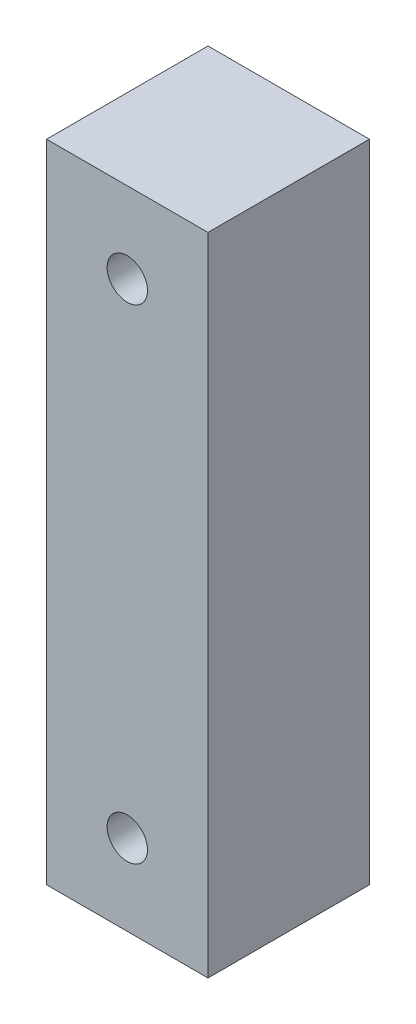
ISO-10303-21;
HEADER;
FILE_DESCRIPTION(('STEP AP214'),'2;1');
FILE_NAME('part.step','',(''),(''),'','','');
FILE_SCHEMA(('AUTOMOTIVE_DESIGN { 1 0 10303 214 1 1 1 1 }'));
ENDSEC;
DATA;
#1=APPLICATION_CONTEXT('core data for automotive mechanical design processes');
#2=APPLICATION_PROTOCOL_DEFINITION('international standard','automotive_design',2000,#1);
#3=PRODUCT_CONTEXT('',#1,'mechanical');
#4=PRODUCT('Part','Part','',(#3));
#5=PRODUCT_RELATED_PRODUCT_CATEGORY('part','',(#4));
#6=PRODUCT_DEFINITION_FORMATION('','',#4);
#7=PRODUCT_DEFINITION_CONTEXT('part definition',#1,'design');
#8=PRODUCT_DEFINITION('design','',#6,#7);
#9=PRODUCT_DEFINITION_SHAPE('','',#8);
#10=(LENGTH_UNIT() NAMED_UNIT(*) SI_UNIT(.MILLI.,.METRE.));
#11=(NAMED_UNIT(*) PLANE_ANGLE_UNIT() SI_UNIT($,.RADIAN.));
#12=(NAMED_UNIT(*) SI_UNIT($,.STERADIAN.) SOLID_ANGLE_UNIT());
#13=UNCERTAINTY_MEASURE_WITH_UNIT(LENGTH_MEASURE(1.E-05),#10,'distance_accuracy_value','');
#14=(GEOMETRIC_REPRESENTATION_CONTEXT(3) GLOBAL_UNCERTAINTY_ASSIGNED_CONTEXT((#13)) GLOBAL_UNIT_ASSIGNED_CONTEXT((#10,
#11,#12)) REPRESENTATION_CONTEXT('',''));
#15=CARTESIAN_POINT('',(0.,0.,0.));
#16=DIRECTION('',(0.,0.,1.));
#17=DIRECTION('',(1.,0.,0.));
#18=AXIS2_PLACEMENT_3D('',#15,#16,#17);
#19=CARTESIAN_POINT('',(0.,0.,38.1));
#20=DIRECTION('',(1.,0.,0.));
#21=DIRECTION('',(0.,1.,0.));
#22=AXIS2_PLACEMENT_3D('',#19,#20,#21);
#23=PLANE('',#22);
#24=DIRECTION('',(0.,-1.,0.));
#25=VECTOR('',#24,1.);
#26=CARTESIAN_POINT('',(0.,0.,0.));
#27=LINE('',#26,#25);
#28=CARTESIAN_POINT('',(0.,152.4,0.));
#29=VERTEX_POINT('',#28);
#30=CARTESIAN_POINT('',(0.,0.,0.));
#31=VERTEX_POINT('',#30);
#32=EDGE_CURVE('E101',#29,#31,#27,.T.);
#33=ORIENTED_EDGE('',*,*,#32,.T.);
#34=DIRECTION('',(0.,0.,-1.));
#35=VECTOR('',#34,1.);
#36=CARTESIAN_POINT('',(0.,0.,38.1));
#37=LINE('',#36,#35);
#38=CARTESIAN_POINT('',(0.,0.,38.1));
#39=VERTEX_POINT('',#38);
#40=EDGE_CURVE('E11',#39,#31,#37,.T.);
#41=ORIENTED_EDGE('',*,*,#40,.F.);
#42=DIRECTION('',(0.,-1.,0.));
#43=VECTOR('',#42,1.);
#44=CARTESIAN_POINT('',(0.,0.,38.1));
#45=LINE('',#44,#43);
#46=CARTESIAN_POINT('',(0.,152.4,38.1));
#47=VERTEX_POINT('',#46);
#48=EDGE_CURVE('E89',#47,#39,#45,.T.);
#49=ORIENTED_EDGE('',*,*,#48,.F.);
#50=DIRECTION('',(0.,0.,-1.));
#51=VECTOR('',#50,1.);
#52=CARTESIAN_POINT('',(0.,152.4,38.1));
#53=LINE('',#52,#51);
#54=EDGE_CURVE('E97',#47,#29,#53,.T.);
#55=ORIENTED_EDGE('',*,*,#54,.T.);
#56=EDGE_LOOP('',(#33,#41,#49,#55));
#57=FACE_BOUND('',#56,.T.);
#58=ADVANCED_FACE('F38',(#57),#23,.F.);
#59=CARTESIAN_POINT('',(0.,0.,38.1));
#60=DIRECTION('',(0.,1.,0.));
#61=DIRECTION('',(0.,0.,1.));
#62=AXIS2_PLACEMENT_3D('',#59,#60,#61);
#63=PLANE('',#62);
#64=DIRECTION('',(1.,0.,0.));
#65=VECTOR('',#64,1.);
#66=CARTESIAN_POINT('',(0.,0.,0.));
#67=LINE('',#66,#65);
#68=CARTESIAN_POINT('',(38.1,0.,0.));
#69=VERTEX_POINT('',#68);
#70=EDGE_CURVE('E93',#31,#69,#67,.T.);
#71=ORIENTED_EDGE('',*,*,#70,.T.);
#72=DIRECTION('',(0.,0.,-1.));
#73=VECTOR('',#72,1.);
#74=CARTESIAN_POINT('',(38.1,0.,38.1));
#75=LINE('',#74,#73);
#76=CARTESIAN_POINT('',(38.1,0.,38.1));
#77=VERTEX_POINT('',#76);
#78=EDGE_CURVE('E46',#77,#69,#75,.T.);
#79=ORIENTED_EDGE('',*,*,#78,.F.);
#80=DIRECTION('',(1.,0.,0.));
#81=VECTOR('',#80,1.);
#82=CARTESIAN_POINT('',(0.,0.,38.1));
#83=LINE('',#82,#81);
#84=EDGE_CURVE('E84',#39,#77,#83,.T.);
#85=ORIENTED_EDGE('',*,*,#84,.F.);
#86=ORIENTED_EDGE('',*,*,#40,.T.);
#87=EDGE_LOOP('',(#71,#79,#85,#86));
#88=FACE_BOUND('',#87,.T.);
#89=ADVANCED_FACE('F92',(#88),#63,.F.);
#90=CARTESIAN_POINT('',(38.1,0.,38.1));
#91=DIRECTION('',(-1.,0.,0.));
#92=DIRECTION('',(0.,-1.,0.));
#93=AXIS2_PLACEMENT_3D('',#90,#91,#92);
#94=PLANE('',#93);
#95=DIRECTION('',(0.,1.,0.));
#96=VECTOR('',#95,1.);
#97=CARTESIAN_POINT('',(38.1,0.,0.));
#98=LINE('',#97,#96);
#99=CARTESIAN_POINT('',(38.1,152.4,0.));
#100=VERTEX_POINT('',#99);
#101=EDGE_CURVE('E71',#69,#100,#98,.T.);
#102=ORIENTED_EDGE('',*,*,#101,.T.);
#103=DIRECTION('',(0.,0.,-1.));
#104=VECTOR('',#103,1.);
#105=CARTESIAN_POINT('',(38.1,152.4,38.1));
#106=LINE('',#105,#104);
#107=CARTESIAN_POINT('',(38.1,152.4,38.1));
#108=VERTEX_POINT('',#107);
#109=EDGE_CURVE('E94',#108,#100,#106,.T.);
#110=ORIENTED_EDGE('',*,*,#109,.F.);
#111=DIRECTION('',(0.,1.,0.));
#112=VECTOR('',#111,1.);
#113=CARTESIAN_POINT('',(38.1,0.,38.1));
#114=LINE('',#113,#112);
#115=EDGE_CURVE('E87',#77,#108,#114,.T.);
#116=ORIENTED_EDGE('',*,*,#115,.F.);
#117=ORIENTED_EDGE('',*,*,#78,.T.);
#118=EDGE_LOOP('',(#102,#110,#116,#117));
#119=FACE_BOUND('',#118,.T.);
#120=ADVANCED_FACE('F95',(#119),#94,.F.);
#121=CARTESIAN_POINT('',(0.,152.4,38.1));
#122=DIRECTION('',(0.,-1.,0.));
#123=DIRECTION('',(0.,0.,-1.));
#124=AXIS2_PLACEMENT_3D('',#121,#122,#123);
#125=PLANE('',#124);
#126=DIRECTION('',(-1.,0.,0.));
#127=VECTOR('',#126,1.);
#128=CARTESIAN_POINT('',(0.,152.4,0.));
#129=LINE('',#128,#127);
#130=EDGE_CURVE('E77',#100,#29,#129,.T.);
#131=ORIENTED_EDGE('',*,*,#130,.T.);
#132=ORIENTED_EDGE('',*,*,#54,.F.);
#133=DIRECTION('',(-1.,0.,0.));
#134=VECTOR('',#133,1.);
#135=CARTESIAN_POINT('',(0.,152.4,38.1));
#136=LINE('',#135,#134);
#137=EDGE_CURVE('E54',#108,#47,#136,.T.);
#138=ORIENTED_EDGE('',*,*,#137,.F.);
#139=ORIENTED_EDGE('',*,*,#109,.T.);
#140=EDGE_LOOP('',(#131,#132,#138,#139));
#141=FACE_BOUND('',#140,.T.);
#142=ADVANCED_FACE('F109',(#141),#125,.F.);
#143=CARTESIAN_POINT('',(0.,0.,38.1));
#144=DIRECTION('',(0.,0.,-1.));
#145=DIRECTION('',(-1.,0.,0.));
#146=AXIS2_PLACEMENT_3D('',#143,#144,#145);
#147=PLANE('',#146);
#148=CARTESIAN_POINT('',(19.05,19.05,38.1));
#149=DIRECTION('',(0.,0.,1.));
#150=DIRECTION('',(1.,0.,0.));
#151=AXIS2_PLACEMENT_3D('',#148,#149,#150);
#152=CIRCLE('',#151,4.7625);
#153=CARTESIAN_POINT('',(23.8125,19.05,38.1));
#154=VERTEX_POINT('',#153);
#155=EDGE_CURVE('E121',#154,#154,#152,.T.);
#156=ORIENTED_EDGE('',*,*,#155,.F.);
#157=EDGE_LOOP('',(#156));
#158=FACE_BOUND('',#157,.T.);
#159=CARTESIAN_POINT('',(19.05,133.35,38.1));
#160=DIRECTION('',(0.,0.,1.));
#161=DIRECTION('',(1.,0.,0.));
#162=AXIS2_PLACEMENT_3D('',#159,#160,#161);
#163=CIRCLE('',#162,4.7625);
#164=CARTESIAN_POINT('',(23.8125,133.35,38.1));
#165=VERTEX_POINT('',#164);
#166=EDGE_CURVE('E115',#165,#165,#163,.T.);
#167=ORIENTED_EDGE('',*,*,#166,.F.);
#168=EDGE_LOOP('',(#167));
#169=FACE_BOUND('',#168,.T.);
#170=ORIENTED_EDGE('',*,*,#48,.T.);
#171=ORIENTED_EDGE('',*,*,#84,.T.);
#172=ORIENTED_EDGE('',*,*,#115,.T.);
#173=ORIENTED_EDGE('',*,*,#137,.T.);
#174=EDGE_LOOP('',(#170,#171,#172,#173));
#175=FACE_BOUND('',#174,.T.);
#176=ADVANCED_FACE('F85',(#158,#169,#175),#147,.F.);
#177=CARTESIAN_POINT('',(0.,0.,0.));
#178=DIRECTION('',(0.,0.,-1.));
#179=DIRECTION('',(-1.,0.,0.));
#180=AXIS2_PLACEMENT_3D('',#177,#178,#179);
#181=PLANE('',#180);
#182=CARTESIAN_POINT('',(19.05,19.05,0.));
#183=DIRECTION('',(0.,0.,1.));
#184=DIRECTION('',(1.,0.,0.));
#185=AXIS2_PLACEMENT_3D('',#182,#183,#184);
#186=CIRCLE('',#185,4.7625);
#187=CARTESIAN_POINT('',(23.8125,19.05,0.));
#188=VERTEX_POINT('',#187);
#189=EDGE_CURVE('E118',#188,#188,#186,.T.);
#190=ORIENTED_EDGE('',*,*,#189,.T.);
#191=EDGE_LOOP('',(#190));
#192=FACE_BOUND('',#191,.T.);
#193=CARTESIAN_POINT('',(19.05,133.35,0.));
#194=DIRECTION('',(0.,0.,1.));
#195=DIRECTION('',(1.,0.,0.));
#196=AXIS2_PLACEMENT_3D('',#193,#194,#195);
#197=CIRCLE('',#196,4.7625);
#198=CARTESIAN_POINT('',(23.8125,133.35,0.));
#199=VERTEX_POINT('',#198);
#200=EDGE_CURVE('E104',#199,#199,#197,.T.);
#201=ORIENTED_EDGE('',*,*,#200,.T.);
#202=EDGE_LOOP('',(#201));
#203=FACE_BOUND('',#202,.T.);
#204=ORIENTED_EDGE('',*,*,#32,.F.);
#205=ORIENTED_EDGE('',*,*,#130,.F.);
#206=ORIENTED_EDGE('',*,*,#101,.F.);
#207=ORIENTED_EDGE('',*,*,#70,.F.);
#208=EDGE_LOOP('',(#204,#205,#206,#207));
#209=FACE_BOUND('',#208,.T.);
#210=ADVANCED_FACE('F112',(#192,#203,#209),#181,.T.);
#211=CARTESIAN_POINT('',(19.05,133.35,0.));
#212=DIRECTION('',(0.,0.,1.));
#213=DIRECTION('',(1.,0.,0.));
#214=AXIS2_PLACEMENT_3D('',#211,#212,#213);
#215=CYLINDRICAL_SURFACE('',#214,4.7625);
#216=CARTESIAN_POINT('',(23.8125,133.35,0.));
#217=CARTESIAN_POINT('',(23.8125,133.35,0.396875));
#218=CARTESIAN_POINT('',(23.8125,133.35,0.79375));
#219=CARTESIAN_POINT('',(23.8125,133.35,1.5875));
#220=CARTESIAN_POINT('',(23.8125,133.35,1.984375));
#221=CARTESIAN_POINT('',(23.8125,133.35,2.778125));
#222=CARTESIAN_POINT('',(23.8125,133.35,3.175));
#223=CARTESIAN_POINT('',(23.8125,133.35,3.96875));
#224=CARTESIAN_POINT('',(23.8125,133.35,4.365625));
#225=CARTESIAN_POINT('',(23.8125,133.35,5.159375));
#226=CARTESIAN_POINT('',(23.8125,133.35,5.55625));
#227=CARTESIAN_POINT('',(23.8125,133.35,6.35));
#228=CARTESIAN_POINT('',(23.8125,133.35,6.746875));
#229=CARTESIAN_POINT('',(23.8125,133.35,7.540625));
#230=CARTESIAN_POINT('',(23.8125,133.35,7.9375));
#231=CARTESIAN_POINT('',(23.8125,133.35,8.73125));
#232=CARTESIAN_POINT('',(23.8125,133.35,9.128125));
#233=CARTESIAN_POINT('',(23.8125,133.35,9.921875));
#234=CARTESIAN_POINT('',(23.8125,133.35,10.31875));
#235=CARTESIAN_POINT('',(23.8125,133.35,11.1125));
#236=CARTESIAN_POINT('',(23.8125,133.35,11.509375));
#237=CARTESIAN_POINT('',(23.8125,133.35,12.303125));
#238=CARTESIAN_POINT('',(23.8125,133.35,12.7));
#239=CARTESIAN_POINT('',(23.8125,133.35,13.49375));
#240=CARTESIAN_POINT('',(23.8125,133.35,13.890625));
#241=CARTESIAN_POINT('',(23.8125,133.35,14.684375));
#242=CARTESIAN_POINT('',(23.8125,133.35,15.08125));
#243=CARTESIAN_POINT('',(23.8125,133.35,15.875));
#244=CARTESIAN_POINT('',(23.8125,133.35,16.271875));
#245=CARTESIAN_POINT('',(23.8125,133.35,17.065625));
#246=CARTESIAN_POINT('',(23.8125,133.35,17.4625));
#247=CARTESIAN_POINT('',(23.8125,133.35,18.25625));
#248=CARTESIAN_POINT('',(23.8125,133.35,18.653125));
#249=CARTESIAN_POINT('',(23.8125,133.35,19.446875));
#250=CARTESIAN_POINT('',(23.8125,133.35,19.84375));
#251=CARTESIAN_POINT('',(23.8125,133.35,20.6375));
#252=CARTESIAN_POINT('',(23.8125,133.35,21.034375));
#253=CARTESIAN_POINT('',(23.8125,133.35,21.828125));
#254=CARTESIAN_POINT('',(23.8125,133.35,22.225));
#255=CARTESIAN_POINT('',(23.8125,133.35,23.01875));
#256=CARTESIAN_POINT('',(23.8125,133.35,23.415625));
#257=CARTESIAN_POINT('',(23.8125,133.35,24.209375));
#258=CARTESIAN_POINT('',(23.8125,133.35,24.60625));
#259=CARTESIAN_POINT('',(23.8125,133.35,25.4));
#260=CARTESIAN_POINT('',(23.8125,133.35,25.796875));
#261=CARTESIAN_POINT('',(23.8125,133.35,26.590625));
#262=CARTESIAN_POINT('',(23.8125,133.35,26.9875));
#263=CARTESIAN_POINT('',(23.8125,133.35,27.78125));
#264=CARTESIAN_POINT('',(23.8125,133.35,28.178125));
#265=CARTESIAN_POINT('',(23.8125,133.35,28.971875));
#266=CARTESIAN_POINT('',(23.8125,133.35,29.36875));
#267=CARTESIAN_POINT('',(23.8125,133.35,30.1625));
#268=CARTESIAN_POINT('',(23.8125,133.35,30.559375));
#269=CARTESIAN_POINT('',(23.8125,133.35,31.353125));
#270=CARTESIAN_POINT('',(23.8125,133.35,31.75));
#271=CARTESIAN_POINT('',(23.8125,133.35,32.54375));
#272=CARTESIAN_POINT('',(23.8125,133.35,32.940625));
#273=CARTESIAN_POINT('',(23.8125,133.35,33.734375));
#274=CARTESIAN_POINT('',(23.8125,133.35,34.13125));
#275=CARTESIAN_POINT('',(23.8125,133.35,34.925));
#276=CARTESIAN_POINT('',(23.8125,133.35,35.321875));
#277=CARTESIAN_POINT('',(23.8125,133.35,36.115625));
#278=CARTESIAN_POINT('',(23.8125,133.35,36.5125));
#279=CARTESIAN_POINT('',(23.8125,133.35,37.30625));
#280=CARTESIAN_POINT('',(23.8125,133.35,37.703125));
#281=CARTESIAN_POINT('',(23.8125,133.35,38.1));
#282=B_SPLINE_CURVE_WITH_KNOTS('',3,(#216,#217,#218,#219,#220,#221,#222,#223,#224,#225,#226,
#227,#228,#229,#230,#231,#232,#233,#234,#235,#236,#237,#238,#239,#240,#241,#242,#243,#244,#245,
#246,#247,#248,#249,#250,#251,#252,#253,#254,#255,#256,#257,#258,#259,#260,#261,#262,#263,#264,
#265,#266,#267,#268,#269,#270,#271,#272,#273,#274,#275,#276,#277,#278,#279,#280,#281),
.UNSPECIFIED.,.F.,.F.,(4,2,2,2,2,2,2,2,2,2,2,2,2,2,2,2,2,2,2,2,2,2,2,2,2,2,2,2,2,2,2,2,4),(0.,
1.190625,2.38125,3.571875,4.7625,5.953125,7.14375,8.334375,9.525,10.715625,11.90625,13.096875,
14.2875,15.478125,16.66875,17.859375,19.05,20.240625,21.43125,22.621875,23.8125,25.003125,
26.19375,27.384375,28.575,29.765625,30.95625,32.146875,33.3375,34.528125,35.71875,36.909375,
38.1),.UNSPECIFIED.);
#283=EDGE_CURVE('BSEAM132',#199,#165,#282,.T.);
#284=ORIENTED_EDGE('',*,*,#200,.F.);
#285=ORIENTED_EDGE('',*,*,#166,.T.);
#286=ORIENTED_EDGE('',*,*,#283,.T.);
#287=ORIENTED_EDGE('',*,*,#283,.F.);
#288=EDGE_LOOP('',(#284,#286,#285,#287));
#289=FACE_BOUND('',#288,.T.);
#290=ADVANCED_FACE('F132',(#289),#215,.F.);
#291=CARTESIAN_POINT('',(19.05,19.05,0.));
#292=DIRECTION('',(0.,0.,1.));
#293=DIRECTION('',(1.,0.,0.));
#294=AXIS2_PLACEMENT_3D('',#291,#292,#293);
#295=CYLINDRICAL_SURFACE('',#294,4.7625);
#296=CARTESIAN_POINT('',(23.8125,19.05,0.));
#297=CARTESIAN_POINT('',(23.8125,19.05,0.396875));
#298=CARTESIAN_POINT('',(23.8125,19.05,0.79375));
#299=CARTESIAN_POINT('',(23.8125,19.05,1.5875));
#300=CARTESIAN_POINT('',(23.8125,19.05,1.984375));
#301=CARTESIAN_POINT('',(23.8125,19.05,2.778125));
#302=CARTESIAN_POINT('',(23.8125,19.05,3.175));
#303=CARTESIAN_POINT('',(23.8125,19.05,3.96875));
#304=CARTESIAN_POINT('',(23.8125,19.05,4.365625));
#305=CARTESIAN_POINT('',(23.8125,19.05,5.159375));
#306=CARTESIAN_POINT('',(23.8125,19.05,5.55625));
#307=CARTESIAN_POINT('',(23.8125,19.05,6.35));
#308=CARTESIAN_POINT('',(23.8125,19.05,6.746875));
#309=CARTESIAN_POINT('',(23.8125,19.05,7.540625));
#310=CARTESIAN_POINT('',(23.8125,19.05,7.9375));
#311=CARTESIAN_POINT('',(23.8125,19.05,8.73125));
#312=CARTESIAN_POINT('',(23.8125,19.05,9.128125));
#313=CARTESIAN_POINT('',(23.8125,19.05,9.921875));
#314=CARTESIAN_POINT('',(23.8125,19.05,10.31875));
#315=CARTESIAN_POINT('',(23.8125,19.05,11.1125));
#316=CARTESIAN_POINT('',(23.8125,19.05,11.509375));
#317=CARTESIAN_POINT('',(23.8125,19.05,12.303125));
#318=CARTESIAN_POINT('',(23.8125,19.05,12.7));
#319=CARTESIAN_POINT('',(23.8125,19.05,13.49375));
#320=CARTESIAN_POINT('',(23.8125,19.05,13.890625));
#321=CARTESIAN_POINT('',(23.8125,19.05,14.684375));
#322=CARTESIAN_POINT('',(23.8125,19.05,15.08125));
#323=CARTESIAN_POINT('',(23.8125,19.05,15.875));
#324=CARTESIAN_POINT('',(23.8125,19.05,16.271875));
#325=CARTESIAN_POINT('',(23.8125,19.05,17.065625));
#326=CARTESIAN_POINT('',(23.8125,19.05,17.4625));
#327=CARTESIAN_POINT('',(23.8125,19.05,18.25625));
#328=CARTESIAN_POINT('',(23.8125,19.05,18.653125));
#329=CARTESIAN_POINT('',(23.8125,19.05,19.446875));
#330=CARTESIAN_POINT('',(23.8125,19.05,19.84375));
#331=CARTESIAN_POINT('',(23.8125,19.05,20.6375));
#332=CARTESIAN_POINT('',(23.8125,19.05,21.034375));
#333=CARTESIAN_POINT('',(23.8125,19.05,21.828125));
#334=CARTESIAN_POINT('',(23.8125,19.05,22.225));
#335=CARTESIAN_POINT('',(23.8125,19.05,23.01875));
#336=CARTESIAN_POINT('',(23.8125,19.05,23.415625));
#337=CARTESIAN_POINT('',(23.8125,19.05,24.209375));
#338=CARTESIAN_POINT('',(23.8125,19.05,24.60625));
#339=CARTESIAN_POINT('',(23.8125,19.05,25.4));
#340=CARTESIAN_POINT('',(23.8125,19.05,25.796875));
#341=CARTESIAN_POINT('',(23.8125,19.05,26.590625));
#342=CARTESIAN_POINT('',(23.8125,19.05,26.9875));
#343=CARTESIAN_POINT('',(23.8125,19.05,27.78125));
#344=CARTESIAN_POINT('',(23.8125,19.05,28.178125));
#345=CARTESIAN_POINT('',(23.8125,19.05,28.971875));
#346=CARTESIAN_POINT('',(23.8125,19.05,29.36875));
#347=CARTESIAN_POINT('',(23.8125,19.05,30.1625));
#348=CARTESIAN_POINT('',(23.8125,19.05,30.559375));
#349=CARTESIAN_POINT('',(23.8125,19.05,31.353125));
#350=CARTESIAN_POINT('',(23.8125,19.05,31.75));
#351=CARTESIAN_POINT('',(23.8125,19.05,32.54375));
#352=CARTESIAN_POINT('',(23.8125,19.05,32.940625));
#353=CARTESIAN_POINT('',(23.8125,19.05,33.734375));
#354=CARTESIAN_POINT('',(23.8125,19.05,34.13125));
#355=CARTESIAN_POINT('',(23.8125,19.05,34.925));
#356=CARTESIAN_POINT('',(23.8125,19.05,35.321875));
#357=CARTESIAN_POINT('',(23.8125,19.05,36.115625));
#358=CARTESIAN_POINT('',(23.8125,19.05,36.5125));
#359=CARTESIAN_POINT('',(23.8125,19.05,37.30625));
#360=CARTESIAN_POINT('',(23.8125,19.05,37.703125));
#361=CARTESIAN_POINT('',(23.8125,19.05,38.1));
#362=B_SPLINE_CURVE_WITH_KNOTS('',3,(#296,#297,#298,#299,#300,#301,#302,#303,#304,#305,#306,
#307,#308,#309,#310,#311,#312,#313,#314,#315,#316,#317,#318,#319,#320,#321,#322,#323,#324,#325,
#326,#327,#328,#329,#330,#331,#332,#333,#334,#335,#336,#337,#338,#339,#340,#341,#342,#343,#344,
#345,#346,#347,#348,#349,#350,#351,#352,#353,#354,#355,#356,#357,#358,#359,#360,#361),
.UNSPECIFIED.,.F.,.F.,(4,2,2,2,2,2,2,2,2,2,2,2,2,2,2,2,2,2,2,2,2,2,2,2,2,2,2,2,2,2,2,2,4),(0.,
1.190625,2.38125,3.571875,4.7625,5.953125,7.14375,8.334375,9.525,10.715625,11.90625,13.096875,
14.2875,15.478125,16.66875,17.859375,19.05,20.240625,21.43125,22.621875,23.8125,25.003125,
26.19375,27.384375,28.575,29.765625,30.95625,32.146875,33.3375,34.528125,35.71875,36.909375,
38.1),.UNSPECIFIED.);
#363=EDGE_CURVE('BSEAM129',#188,#154,#362,.T.);
#364=ORIENTED_EDGE('',*,*,#189,.F.);
#365=ORIENTED_EDGE('',*,*,#155,.T.);
#366=ORIENTED_EDGE('',*,*,#363,.T.);
#367=ORIENTED_EDGE('',*,*,#363,.F.);
#368=EDGE_LOOP('',(#364,#366,#365,#367));
#369=FACE_BOUND('',#368,.T.);
#370=ADVANCED_FACE('F129',(#369),#295,.F.);
#371=CLOSED_SHELL('',(#58,#89,#120,#142,#176,#210,#290,#370));
#372=MANIFOLD_SOLID_BREP('B2',#371);
#373=ADVANCED_BREP_SHAPE_REPRESENTATION('',(#18,#372),#14);
#374=SHAPE_DEFINITION_REPRESENTATION(#9,#373);
ENDSEC;
END-ISO-10303-21;
